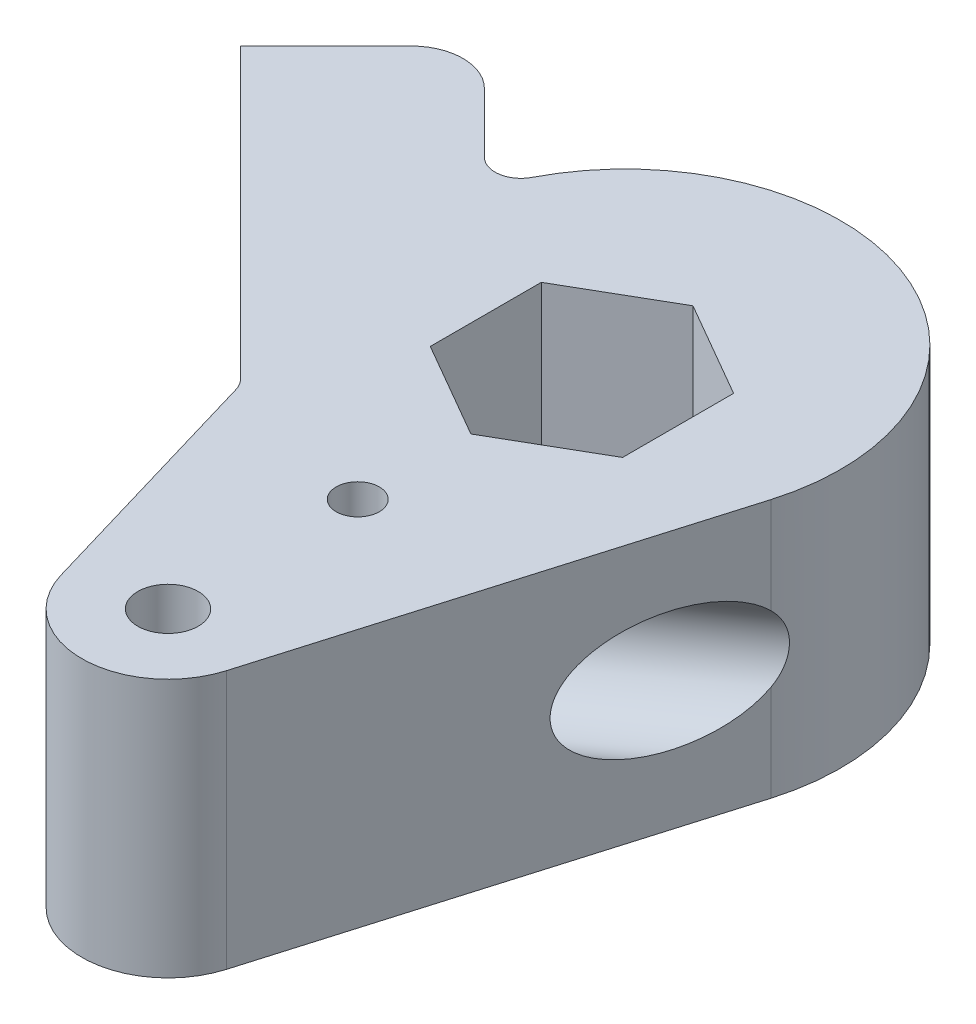
ISO-10303-21;
HEADER;
FILE_DESCRIPTION(('STEP AP214'),'2;1');
FILE_NAME('part.step','',(''),(''),'','','');
FILE_SCHEMA(('AUTOMOTIVE_DESIGN { 1 0 10303 214 1 1 1 1 }'));
ENDSEC;
DATA;
#1=APPLICATION_CONTEXT('core data for automotive mechanical design processes');
#2=APPLICATION_PROTOCOL_DEFINITION('international standard','automotive_design',2000,#1);
#3=PRODUCT_CONTEXT('',#1,'mechanical');
#4=PRODUCT('Part','Part','',(#3));
#5=PRODUCT_RELATED_PRODUCT_CATEGORY('part','',(#4));
#6=PRODUCT_DEFINITION_FORMATION('','',#4);
#7=PRODUCT_DEFINITION_CONTEXT('part definition',#1,'design');
#8=PRODUCT_DEFINITION('design','',#6,#7);
#9=PRODUCT_DEFINITION_SHAPE('','',#8);
#10=(LENGTH_UNIT() NAMED_UNIT(*) SI_UNIT(.MILLI.,.METRE.));
#11=(NAMED_UNIT(*) PLANE_ANGLE_UNIT() SI_UNIT($,.RADIAN.));
#12=(NAMED_UNIT(*) SI_UNIT($,.STERADIAN.) SOLID_ANGLE_UNIT());
#13=UNCERTAINTY_MEASURE_WITH_UNIT(LENGTH_MEASURE(1.E-05),#10,'distance_accuracy_value','');
#14=(GEOMETRIC_REPRESENTATION_CONTEXT(3) GLOBAL_UNCERTAINTY_ASSIGNED_CONTEXT((#13)) GLOBAL_UNIT_ASSIGNED_CONTEXT((#10,
#11,#12)) REPRESENTATION_CONTEXT('',''));
#15=CARTESIAN_POINT('',(0.,0.,0.));
#16=DIRECTION('',(0.,0.,1.));
#17=DIRECTION('',(1.,0.,0.));
#18=AXIS2_PLACEMENT_3D('',#15,#16,#17);
#19=CARTESIAN_POINT('',(21.5433225867882,7.5,-2.08479687335261));
#20=DIRECTION('',(-0.819152044288991,0.,0.573576436351047));
#21=DIRECTION('',(0.573576436351047,0.,0.819152044288991));
#22=AXIS2_PLACEMENT_3D('',#19,#20,#21);
#23=CYLINDRICAL_SURFACE('',#22,1.95);
#24=CARTESIAN_POINT('',(0.716970545438802,8.99666295470958,14.0239400553612));
#25=CARTESIAN_POINT('',(0.74244034188439,8.99665153578094,14.006111246936));
#26=CARTESIAN_POINT('',(0.767222036106041,8.99763278965821,13.9873367591717));
#27=CARTESIAN_POINT('',(0.815208565556345,9.00147451084377,13.9480994698423));
#28=CARTESIAN_POINT('',(0.83841523047688,9.00433275497132,13.9276386906281));
#29=CARTESIAN_POINT('',(0.905016488414462,9.01549340190903,13.8643856355436));
#30=CARTESIAN_POINT('',(0.945904236156547,9.02638600169875,13.81936136744));
#31=CARTESIAN_POINT('',(1.01990610183928,9.05334430395239,13.7251740505432));
#32=CARTESIAN_POINT('',(1.05305281266805,9.0693876158075,13.6760295836279));
#33=CARTESIAN_POINT('',(1.11177481728667,9.10478716029796,13.5743788922074));
#34=CARTESIAN_POINT('',(1.13732995953031,9.12415199888252,13.5218641624224));
#35=CARTESIAN_POINT('',(1.18382634382519,9.16726910150522,13.4067373087248));
#36=CARTESIAN_POINT('',(1.20360946888743,9.19125504598093,13.3437452964728));
#37=CARTESIAN_POINT('',(1.23307169573789,9.23901171240449,13.2153476321127));
#38=CARTESIAN_POINT('',(1.24274681928874,9.26278234596579,13.1499410401684));
#39=CARTESIAN_POINT('',(1.25220869513291,9.31108197191154,13.0090240557059));
#40=CARTESIAN_POINT('',(1.25055105281718,9.33530983671658,12.9333029874027));
#41=CARTESIAN_POINT('',(1.23317320275807,9.37828509148767,12.781892070439));
#42=CARTESIAN_POINT('',(1.21746657045799,9.39703774891171,12.7062022621936));
#43=CARTESIAN_POINT('',(1.17411124991937,9.42515870825533,12.5654961550458));
#44=CARTESIAN_POINT('',(1.14790061168448,9.43530952653827,12.5001974119533));
#45=CARTESIAN_POINT('',(1.08447316569616,9.44817187102651,12.374410500201));
#46=CARTESIAN_POINT('',(1.04726882690009,9.45089178967662,12.3139169795969));
#47=CARTESIAN_POINT('',(0.969196678887126,9.44874693885896,12.2082593735044));
#48=CARTESIAN_POINT('',(0.929584436397717,9.44489722642764,12.1621364310037));
#49=CARTESIAN_POINT('',(0.84454965403594,9.43185091254498,12.0764867696995));
#50=CARTESIAN_POINT('',(0.799126643126686,9.42265387741045,12.0369605862469));
#51=CARTESIAN_POINT('',(0.70385939308494,9.39969110247294,11.9652824271803));
#52=CARTESIAN_POINT('',(0.654013987931288,9.38592415511509,11.9331324044466));
#53=CARTESIAN_POINT('',(0.551178744777926,9.354868658165,11.8765455922883));
#54=CARTESIAN_POINT('',(0.498188476733835,9.3375796261552,11.8521098606552));
#55=CARTESIAN_POINT('',(0.383196039082617,9.29828679872873,11.8083996610312));
#56=CARTESIAN_POINT('',(0.320904653355299,9.2759630388235,11.7901763681155));
#57=CARTESIAN_POINT('',(0.194607551586207,9.2300475693117,11.7635515298522));
#58=CARTESIAN_POINT('',(0.130598754421194,9.20645349211165,11.7551690385292));
#59=CARTESIAN_POINT('',(-0.00733161160222996,9.15667029506228,11.7478550930901));
#60=CARTESIAN_POINT('',(-0.0813772889574155,9.13058486330539,11.7504243865547));
#61=CARTESIAN_POINT('',(-0.228987202426297,9.08277083102809,11.7689156156727));
#62=CARTESIAN_POINT('',(-0.302552178131016,9.06102516704794,11.7847839271504));
#63=CARTESIAN_POINT('',(-0.434538738181924,9.02883732389422,11.8263068735044));
#64=CARTESIAN_POINT('',(-0.493322279856361,9.01707123527352,11.8497129565178));
#65=CARTESIAN_POINT('',(-0.579171075303788,9.0049891501035,11.8918056696129));
#66=CARTESIAN_POINT('',(-0.607543002747302,9.00188827372152,11.907100017152));
#67=CARTESIAN_POINT('',(-0.663171634436151,8.99771672338337,11.9399289377363));
#68=CARTESIAN_POINT('',(-0.690426603656105,8.99664909891057,11.9574668336978));
#69=CARTESIAN_POINT('',(-0.716970545438816,8.99666295470958,11.9760599446388));
#70=B_SPLINE_CURVE_WITH_KNOTS('',3,(#24,#25,#26,#27,#28,#29,#30,#31,#32,#33,#34,#35,#36,#37,#38,
#39,#40,#41,#42,#43,#44,#45,#46,#47,#48,#49,#50,#51,#52,#53,#54,#55,#56,#57,#58,#59,#60,#61,#62,
#63,#64,#65,#66,#67,#68,#69),.UNSPECIFIED.,.F.,.F.,(4,2,2,2,2,2,2,2,2,2,2,2,2,2,2,2,2,2,2,2,2,2,
4),(0.,0.0931931628247664,0.186276142625983,0.370592708225991,0.554118642209381,
0.738127473230242,0.948073691711505,1.15810250828169,1.39535710413075,1.63238268985327,
1.84435012875189,2.05607807284427,2.23796198174081,2.41986064400171,2.60180740952768,
2.78377911295526,2.98888635778984,3.19439008520416,3.42889590928542,3.66246068523198,
3.85439322248913,3.95138849787021,4.04852913313194),.UNSPECIFIED.);
#71=CARTESIAN_POINT('',(0.716970545438809,8.99666295470958,14.0239400553612));
#72=VERTEX_POINT('',#71);
#73=CARTESIAN_POINT('',(-0.71697054543881,8.99666295470958,11.9760599446388));
#74=VERTEX_POINT('',#73);
#75=EDGE_CURVE('E207',#72,#74,#70,.T.);
#76=ORIENTED_EDGE('',*,*,#75,.T.);
#77=CARTESIAN_POINT('',(0.,7.5,13.));
#78=DIRECTION('',(-0.819152044288991,0.,0.573576436351047));
#79=DIRECTION('',(0.573576436351047,0.,0.819152044288991));
#80=AXIS2_PLACEMENT_3D('',#77,#78,#79);
#81=CIRCLE('',#80,1.95);
#82=CARTESIAN_POINT('',(-0.71697054543881,6.00333704529042,11.9760599446388));
#83=VERTEX_POINT('',#82);
#84=EDGE_CURVE('E468',#74,#83,#81,.T.);
#85=ORIENTED_EDGE('',*,*,#84,.T.);
#86=CARTESIAN_POINT('',(-0.716970545438816,6.00333704529042,11.9760599446388));
#87=CARTESIAN_POINT('',(-0.691505762293426,6.00334846421906,11.9582239764789));
#88=CARTESIAN_POINT('',(-0.66538767607272,6.00236721034179,11.9413580542842));
#89=CARTESIAN_POINT('',(-0.612104325149941,5.99852548915622,11.9096854099828));
#90=CARTESIAN_POINT('',(-0.584940335044608,5.99566724502868,11.8948762768433));
#91=CARTESIAN_POINT('',(-0.502722934154049,5.98450659809097,11.8539253851901));
#92=CARTESIAN_POINT('',(-0.446429528317821,5.97361399830125,11.8309026769862));
#93=CARTESIAN_POINT('',(-0.332612272951119,5.94665569604761,11.7935776295043));
#94=CARTESIAN_POINT('',(-0.275094737249922,5.93061238419249,11.7792383075532));
#95=CARTESIAN_POINT('',(-0.159490224188266,5.89521283970203,11.7588242571841));
#96=CARTESIAN_POINT('',(-0.101402146713858,5.87584800111748,11.7527713740024));
#97=CARTESIAN_POINT('',(0.0226844081808215,5.83273089849478,11.7484547677896));
#98=CARTESIAN_POINT('',(0.0886437645316572,5.80874495401907,11.7514092482113));
#99=CARTESIAN_POINT('',(0.219374777307086,5.76098828759551,11.7676383986151));
#100=CARTESIAN_POINT('',(0.284145956251446,5.7372176540342,11.7809171283604));
#101=CARTESIAN_POINT('',(0.41980075882661,5.68891802808846,11.8202223206737));
#102=CARTESIAN_POINT('',(0.490388340886741,5.66469016328342,11.8476781255596));
#103=CARTESIAN_POINT('',(0.626724487496084,5.62171490851233,11.9157935465462));
#104=CARTESIAN_POINT('',(0.6924776571425,5.60296225108828,11.9564403920804));
#105=CARTESIAN_POINT('',(0.809869754784223,5.57484129174466,12.0453053897958));
#106=CARTESIAN_POINT('',(0.862265935569119,5.56469047346172,12.0922688186027));
#107=CARTESIAN_POINT('',(0.958773504166474,5.55182812897349,12.1948927791393));
#108=CARTESIAN_POINT('',(1.00289418579616,5.54910821032338,12.2505434243544));
#109=CARTESIAN_POINT('',(1.0754776113181,5.55125306114104,12.3600442753103));
#110=CARTESIAN_POINT('',(1.10527081518127,5.55510277357236,12.4130425826751));
#111=CARTESIAN_POINT('',(1.15667156143053,5.56814908745502,12.5222430496057));
#112=CARTESIAN_POINT('',(1.17827843964736,5.57734612258955,12.5784454687006));
#113=CARTESIAN_POINT('',(1.2130505582802,5.60030889752706,12.6924827748046));
#114=CARTESIAN_POINT('',(1.22621356478641,5.61407584488491,12.7503180895909));
#115=CARTESIAN_POINT('',(1.24421605000313,5.645131341835,12.8663054383436));
#116=CARTESIAN_POINT('',(1.24905438763093,5.6624203738448,12.9244575146335));
#117=CARTESIAN_POINT('',(1.25079880966386,5.70171320127127,13.0474648284807));
#118=CARTESIAN_POINT('',(1.24661819486872,5.7240369611765,13.1122323172421));
#119=CARTESIAN_POINT('',(1.22844120606573,5.7699524306883,13.2400190028));
#120=CARTESIAN_POINT('',(1.2144258733252,5.79354650788835,13.303034578045));
#121=CARTESIAN_POINT('',(1.17412377032693,5.84332970493772,13.4351482418469));
#122=CARTESIAN_POINT('',(1.14638431103591,5.86941513669461,13.5038496683397));
#123=CARTESIAN_POINT('',(1.07852267572352,5.91722916897192,13.636233241948));
#124=CARTESIAN_POINT('',(1.03845063698937,5.93897483295206,13.6999344246001));
#125=CARTESIAN_POINT('',(0.954289768521492,5.97116267610578,13.8097595370595));
#126=CARTESIAN_POINT('',(0.912190089683654,5.98292876472648,13.8569926455277));
#127=CARTESIAN_POINT('',(0.843273860476016,5.99501084989651,13.9232675693473));
#128=CARTESIAN_POINT('',(0.81919810426314,5.99811172627848,13.944697485266));
#129=CARTESIAN_POINT('',(0.769322897258523,6.00228327661663,13.985743147845));
#130=CARTESIAN_POINT('',(0.743520917360457,6.00335090108943,14.0053561276104));
#131=CARTESIAN_POINT('',(0.716970545438803,6.00333704529042,14.0239400553612));
#132=B_SPLINE_CURVE_WITH_KNOTS('',3,(#86,#87,#88,#89,#90,#91,#92,#93,#94,#95,#96,#97,#98,#99,
#100,#101,#102,#103,#104,#105,#106,#107,#108,#109,#110,#111,#112,#113,#114,#115,#116,#117,#118,
#119,#120,#121,#122,#123,#124,#125,#126,#127,#128,#129,#130,#131),.UNSPECIFIED.,.F.,.F.,(4,2,2,
2,2,2,2,2,2,2,2,2,2,2,2,2,2,2,2,2,2,2,4),(0.,0.093193162824766,0.186276142625983,
0.370592708225991,0.554118642209382,0.738127473230242,0.948073691711505,1.15810250828169,
1.39535710413076,1.63238268985327,1.84435012875189,2.05607807284427,2.23796198174081,
2.41986064400171,2.60180740952768,2.78377911295526,2.98888635778984,3.19439008520417,
3.42889590928542,3.66246068523198,3.85439322248913,3.95138849787022,4.04852913313194),.UNSPECIFIED.);
#133=CARTESIAN_POINT('',(0.716970545438809,6.00333704529042,14.0239400553612));
#134=VERTEX_POINT('',#133);
#135=EDGE_CURVE('E198',#83,#134,#132,.T.);
#136=ORIENTED_EDGE('',*,*,#135,.T.);
#137=EDGE_CURVE('E466',#134,#72,#81,.T.);
#138=ORIENTED_EDGE('',*,*,#137,.T.);
#139=EDGE_LOOP('',(#76,#85,#136,#138));
#140=FACE_BOUND('',#139,.T.);
#141=CARTESIAN_POINT('',(5.73406431002294,7.5,8.98496494554267));
#142=DIRECTION('',(0.819152044288991,0.,-0.573576436351047));
#143=DIRECTION('',(-0.573576436351047,0.,-0.819152044288991));
#144=AXIS2_PLACEMENT_3D('',#141,#142,#143);
#145=CIRCLE('',#144,1.95);
#146=CARTESIAN_POINT('',(4.6155902591384,7.5,7.38761845917913));
#147=VERTEX_POINT('',#146);
#148=EDGE_CURVE('E182',#147,#147,#145,.F.);
#149=ORIENTED_EDGE('',*,*,#148,.F.);
#150=EDGE_LOOP('',(#149));
#151=FACE_BOUND('',#150,.T.);
#152=ADVANCED_FACE('F36',(#140,#151),#23,.F.);
#153=CARTESIAN_POINT('',(0.,15.,-2.5));
#154=DIRECTION('',(0.,-1.,0.));
#155=DIRECTION('',(0.,0.,-1.));
#156=AXIS2_PLACEMENT_3D('',#153,#154,#155);
#157=CYLINDRICAL_SURFACE('',#156,12.5);
#158=DIRECTION('',(0.,-1.,0.));
#159=VECTOR('',#158,1.);
#160=CARTESIAN_POINT('',(11.9889292708857,15.,1.03773584905661));
#161=LINE('',#160,#159);
#162=CARTESIAN_POINT('',(11.9889292708857,15.,1.03773584905661));
#163=VERTEX_POINT('',#162);
#164=CARTESIAN_POINT('',(11.9889292708857,9.42610876795671,1.03773584905661));
#165=VERTEX_POINT('',#164);
#166=EDGE_CURVE('E180',#163,#165,#161,.T.);
#167=ORIENTED_EDGE('',*,*,#166,.T.);
#168=CARTESIAN_POINT('',(11.9889292708857,9.42610876795671,1.03773584905661));
#169=CARTESIAN_POINT('',(12.0047331476933,9.37330231806729,0.984185218039004));
#170=CARTESIAN_POINT('',(12.0196692676194,9.31862633595629,0.932239149187983));
#171=CARTESIAN_POINT('',(12.0478301443979,9.20549067272676,0.832039973463307));
#172=CARTESIAN_POINT('',(12.0610533696007,9.1470276744127,0.783790187297182));
#173=CARTESIAN_POINT('',(12.0982745098479,8.96543030851816,0.644987884657432));
#174=CARTESIAN_POINT('',(12.1196649814929,8.83661887281538,0.560932222336484));
#175=CARTESIAN_POINT('',(12.1556744261868,8.56528221874335,0.414676315717395));
#176=CARTESIAN_POINT('',(12.1702569249279,8.42268796297729,0.352594215901582));
#177=CARTESIAN_POINT('',(12.1926505572115,8.12841067974923,0.25532328943551));
#178=CARTESIAN_POINT('',(12.2004810310948,7.97675495106006,0.220057684758262));
#179=CARTESIAN_POINT('',(12.2091984018924,7.68246220607608,0.180641747240069));
#180=CARTESIAN_POINT('',(12.2106208984856,7.54016021976855,0.174092589306254));
#181=CARTESIAN_POINT('',(12.2080128923116,7.25664262891204,0.185974928085635));
#182=CARTESIAN_POINT('',(12.2039823323694,7.11542703576947,0.204406686722752));
#183=CARTESIAN_POINT('',(12.1907846494979,6.84647476570445,0.263257461652661));
#184=CARTESIAN_POINT('',(12.1819247797935,6.71842925154846,0.302357405620548));
#185=CARTESIAN_POINT('',(12.1591682383308,6.47008423390452,0.399501120331491));
#186=CARTESIAN_POINT('',(12.1452643285045,6.34979615576545,0.457572102052418));
#187=CARTESIAN_POINT('',(12.1112720025954,6.11208514399124,0.593911911947338));
#188=CARTESIAN_POINT('',(12.0908540885583,5.99530026637814,0.673208339741153));
#189=CARTESIAN_POINT('',(12.0558670754762,5.82987828981024,0.802736397052253));
#190=CARTESIAN_POINT('',(12.0434996289924,5.77643567445633,0.847601890022232));
#191=CARTESIAN_POINT('',(12.0173091633876,5.67276555910011,0.940437610007517));
#192=CARTESIAN_POINT('',(12.0034872226069,5.62253572100025,0.988405526904892));
#193=CARTESIAN_POINT('',(11.9889292708857,5.57389123204329,1.03773584905661));
#194=B_SPLINE_CURVE_WITH_KNOTS('',3,(#168,#169,#170,#171,#172,#173,#174,#175,#176,#177,#178,
#179,#180,#181,#182,#183,#184,#185,#186,#187,#188,#189,#190,#191,#192,#193),.UNSPECIFIED.,.F.,
.F.,(4,2,2,2,2,2,2,2,2,2,2,2,4),(0.,0.230468757514471,0.461142195368183,0.924808370598939,
1.39093095007059,1.855713901147,2.28082701137157,2.70594457892474,3.10672609601005,
3.50808501398563,3.9342836766376,4.14675297514224,4.35906584731251),.UNSPECIFIED.);
#195=CARTESIAN_POINT('',(11.9889292708857,5.57389123204329,1.03773584905661));
#196=VERTEX_POINT('',#195);
#197=EDGE_CURVE('E50',#165,#196,#194,.T.);
#198=ORIENTED_EDGE('',*,*,#197,.T.);
#199=CARTESIAN_POINT('',(11.9889292708857,0.,1.03773584905661));
#200=VERTEX_POINT('',#199);
#201=EDGE_CURVE('E177',#196,#200,#161,.T.);
#202=ORIENTED_EDGE('',*,*,#201,.T.);
#203=CARTESIAN_POINT('',(0.,0.,-2.5));
#204=DIRECTION('',(0.,1.,0.));
#205=DIRECTION('',(0.,0.,-1.));
#206=AXIS2_PLACEMENT_3D('',#203,#204,#205);
#207=CIRCLE('',#206,12.5);
#208=CARTESIAN_POINT('',(-11.1125712251908,0.,-8.22370166632228));
#209=VERTEX_POINT('',#208);
#210=EDGE_CURVE('E340',#200,#209,#207,.T.);
#211=ORIENTED_EDGE('',*,*,#210,.T.);
#212=DIRECTION('',(0.,-1.,0.));
#213=VECTOR('',#212,1.);
#214=CARTESIAN_POINT('',(-11.1125712251908,15.,-8.22370166632228));
#215=LINE('',#214,#213);
#216=CARTESIAN_POINT('',(-11.1125712251908,15.,-8.22370166632228));
#217=VERTEX_POINT('',#216);
#218=EDGE_CURVE('E293',#209,#217,#215,.F.);
#219=ORIENTED_EDGE('',*,*,#218,.T.);
#220=CARTESIAN_POINT('',(0.,15.,-2.5));
#221=DIRECTION('',(0.,1.,0.));
#222=DIRECTION('',(0.,0.,-1.));
#223=AXIS2_PLACEMENT_3D('',#220,#221,#222);
#224=CIRCLE('',#223,12.5);
#225=EDGE_CURVE('E355',#163,#217,#224,.T.);
#226=ORIENTED_EDGE('',*,*,#225,.F.);
#227=EDGE_LOOP('',(#167,#198,#202,#211,#219,#226));
#228=FACE_BOUND('',#227,.T.);
#229=ADVANCED_FACE('F176',(#228),#157,.T.);
#230=CARTESIAN_POINT('',(-4.79557170835427,15.,25.4150943396226));
#231=DIRECTION('',(0.959114341670855,0.,-0.283018867924529));
#232=DIRECTION('',(-0.283018867924529,0.,-0.959114341670855));
#233=AXIS2_PLACEMENT_3D('',#230,#231,#232);
#234=PLANE('',#233);
#235=DIRECTION('',(0.283018867924529,0.,0.959114341670855));
#236=VECTOR('',#235,1.);
#237=CARTESIAN_POINT('',(-4.79557170835427,15.,25.4150943396226));
#238=LINE('',#237,#236);
#239=CARTESIAN_POINT('',(-9.04592973589662,15.,11.0111806664933));
#240=VERTEX_POINT('',#239);
#241=CARTESIAN_POINT('',(-4.79557170835427,15.,25.4150943396226));
#242=VERTEX_POINT('',#241);
#243=EDGE_CURVE('E191',#240,#242,#238,.T.);
#244=ORIENTED_EDGE('',*,*,#243,.F.);
#245=DIRECTION('',(0.,1.,0.));
#246=VECTOR('',#245,1.);
#247=CARTESIAN_POINT('',(-9.04592973589662,0.,11.0111806664933));
#248=LINE('',#247,#246);
#249=CARTESIAN_POINT('',(-9.04592973589662,0.,11.0111806664933));
#250=VERTEX_POINT('',#249);
#251=EDGE_CURVE('E284',#240,#250,#248,.F.);
#252=ORIENTED_EDGE('',*,*,#251,.T.);
#253=DIRECTION('',(0.283018867924529,0.,0.959114341670855));
#254=VECTOR('',#253,1.);
#255=CARTESIAN_POINT('',(-4.79557170835427,0.,25.4150943396226));
#256=LINE('',#255,#254);
#257=CARTESIAN_POINT('',(-4.79557170835427,0.,25.4150943396226));
#258=VERTEX_POINT('',#257);
#259=EDGE_CURVE('E348',#250,#258,#256,.T.);
#260=ORIENTED_EDGE('',*,*,#259,.T.);
#261=DIRECTION('',(0.,-1.,0.));
#262=VECTOR('',#261,1.);
#263=CARTESIAN_POINT('',(-4.79557170835427,15.,25.4150943396226));
#264=LINE('',#263,#262);
#265=EDGE_CURVE('E187',#242,#258,#264,.T.);
#266=ORIENTED_EDGE('',*,*,#265,.F.);
#267=EDGE_LOOP('',(#244,#252,#260,#266));
#268=FACE_BOUND('',#267,.T.);
#269=ADVANCED_FACE('F315',(#268),#234,.F.);
#270=CARTESIAN_POINT('',(0.,15.,24.));
#271=DIRECTION('',(0.,1.,0.));
#272=DIRECTION('',(0.,0.,1.));
#273=AXIS2_PLACEMENT_3D('',#270,#271,#272);
#274=PLANE('',#273);
#275=ORIENTED_EDGE('',*,*,#225,.T.);
#276=CARTESIAN_POINT('',(-12.4460797722137,15.,-8.91054586628096));
#277=DIRECTION('',(0.,1.,0.));
#278=DIRECTION('',(0.,0.,1.));
#279=AXIS2_PLACEMENT_3D('',#276,#277,#278);
#280=CIRCLE('',#279,1.5);
#281=CARTESIAN_POINT('',(-13.5067399439936,15.,-7.84988569450113));
#282=VERTEX_POINT('',#281);
#283=EDGE_CURVE('E44',#217,#282,#280,.F.);
#284=ORIENTED_EDGE('',*,*,#283,.T.);
#285=DIRECTION('',(-0.707106781186549,0.,-0.707106781186546));
#286=VECTOR('',#285,1.);
#287=CARTESIAN_POINT('',(-19.0918830920368,15.,-13.4350288425444));
#288=LINE('',#287,#286);
#289=CARTESIAN_POINT('',(-16.9705627484772,15.,-11.3137084989847));
#290=VERTEX_POINT('',#289);
#291=EDGE_CURVE('E510',#282,#290,#288,.T.);
#292=ORIENTED_EDGE('',*,*,#291,.T.);
#293=CARTESIAN_POINT('',(-19.0918830920368,15.,-9.19238815542507));
#294=DIRECTION('',(0.,1.,0.));
#295=DIRECTION('',(0.,0.,1.));
#296=AXIS2_PLACEMENT_3D('',#293,#294,#295);
#297=CIRCLE('',#296,3.);
#298=CARTESIAN_POINT('',(-21.2132034355964,15.,-11.3137084989847));
#299=VERTEX_POINT('',#298);
#300=EDGE_CURVE('E263',#290,#299,#297,.T.);
#301=ORIENTED_EDGE('',*,*,#300,.T.);
#302=DIRECTION('',(-0.707106781186546,0.,0.707106781186549));
#303=VECTOR('',#302,1.);
#304=CARTESIAN_POINT('',(-19.0918830920368,15.,-13.4350288425444));
#305=LINE('',#304,#303);
#306=CARTESIAN_POINT('',(-26.1629509039023,15.,-6.36396103067887));
#307=VERTEX_POINT('',#306);
#308=EDGE_CURVE('E511',#299,#307,#305,.T.);
#309=ORIENTED_EDGE('',*,*,#308,.T.);
#310=DIRECTION('',(0.707106781186549,0.,0.707106781186546));
#311=VECTOR('',#310,1.);
#312=CARTESIAN_POINT('',(-26.1629509039023,15.,-6.36396103067887));
#313=LINE('',#312,#311);
#314=CARTESIAN_POINT('',(-9.42394107662308,15.,10.3750487966002));
#315=VERTEX_POINT('',#314);
#316=EDGE_CURVE('E512',#307,#315,#313,.T.);
#317=ORIENTED_EDGE('',*,*,#316,.T.);
#318=CARTESIAN_POINT('',(-10.4846012484029,15.,11.4357089683801));
#319=DIRECTION('',(0.,1.,0.));
#320=DIRECTION('',(0.,0.,1.));
#321=AXIS2_PLACEMENT_3D('',#318,#319,#320);
#322=CIRCLE('',#321,1.5);
#323=EDGE_CURVE('E290',#315,#240,#322,.F.);
#324=ORIENTED_EDGE('',*,*,#323,.T.);
#325=ORIENTED_EDGE('',*,*,#243,.T.);
#326=CARTESIAN_POINT('',(0.,15.,24.));
#327=DIRECTION('',(0.,1.,0.));
#328=DIRECTION('',(0.,0.,1.));
#329=AXIS2_PLACEMENT_3D('',#326,#327,#328);
#330=CIRCLE('',#329,5.);
#331=CARTESIAN_POINT('',(4.79557170835428,15.,25.4150943396226));
#332=VERTEX_POINT('',#331);
#333=EDGE_CURVE('E349',#242,#332,#330,.T.);
#334=ORIENTED_EDGE('',*,*,#333,.T.);
#335=DIRECTION('',(0.283018867924528,0.,-0.959114341670855));
#336=VECTOR('',#335,1.);
#337=CARTESIAN_POINT('',(11.9889292708857,15.,1.03773584905661));
#338=LINE('',#337,#336);
#339=EDGE_CURVE('E352',#332,#163,#338,.T.);
#340=ORIENTED_EDGE('',*,*,#339,.T.);
#341=EDGE_LOOP('',(#275,#284,#292,#301,#309,#317,#324,#325,#334,#340));
#342=FACE_BOUND('',#341,.T.);
#343=CARTESIAN_POINT('',(0.,15.,13.));
#344=DIRECTION('',(0.,1.,0.));
#345=DIRECTION('',(0.,0.,1.));
#346=AXIS2_PLACEMENT_3D('',#343,#344,#345);
#347=CIRCLE('',#346,1.25);
#348=CARTESIAN_POINT('',(0.,15.,14.25));
#349=VERTEX_POINT('',#348);
#350=EDGE_CURVE('E404',#349,#349,#347,.T.);
#351=ORIENTED_EDGE('',*,*,#350,.F.);
#352=EDGE_LOOP('',(#351));
#353=FACE_BOUND('',#352,.T.);
#354=DIRECTION('',(0.866025403784439,0.,-0.5));
#355=VECTOR('',#354,1.);
#356=CARTESIAN_POINT('',(0.,15.,6.43745550146433));
#357=LINE('',#356,#355);
#358=CARTESIAN_POINT('',(0.,15.,6.43745550146433));
#359=VERTEX_POINT('',#358);
#360=CARTESIAN_POINT('',(5.575,15.,3.21872775073217));
#361=VERTEX_POINT('',#360);
#362=EDGE_CURVE('E414',#359,#361,#357,.T.);
#363=ORIENTED_EDGE('',*,*,#362,.F.);
#364=DIRECTION('',(0.866025403784438,0.,0.5));
#365=VECTOR('',#364,1.);
#366=CARTESIAN_POINT('',(-5.575,15.,3.21872775073216));
#367=LINE('',#366,#365);
#368=CARTESIAN_POINT('',(-5.575,15.,3.21872775073216));
#369=VERTEX_POINT('',#368);
#370=EDGE_CURVE('E406',#369,#359,#367,.T.);
#371=ORIENTED_EDGE('',*,*,#370,.F.);
#372=DIRECTION('',(0.,0.,1.));
#373=VECTOR('',#372,1.);
#374=CARTESIAN_POINT('',(-5.575,15.,-3.21872775073217));
#375=LINE('',#374,#373);
#376=CARTESIAN_POINT('',(-5.575,15.,-3.21872775073217));
#377=VERTEX_POINT('',#376);
#378=EDGE_CURVE('E423',#377,#369,#375,.T.);
#379=ORIENTED_EDGE('',*,*,#378,.F.);
#380=DIRECTION('',(-0.866025403784439,0.,0.5));
#381=VECTOR('',#380,1.);
#382=CARTESIAN_POINT('',(0.,15.,-6.43745550146433));
#383=LINE('',#382,#381);
#384=CARTESIAN_POINT('',(0.,15.,-6.43745550146433));
#385=VERTEX_POINT('',#384);
#386=EDGE_CURVE('E420',#385,#377,#383,.T.);
#387=ORIENTED_EDGE('',*,*,#386,.F.);
#388=DIRECTION('',(-0.866025403784439,0.,-0.5));
#389=VECTOR('',#388,1.);
#390=CARTESIAN_POINT('',(5.575,15.,-3.21872775073216));
#391=LINE('',#390,#389);
#392=CARTESIAN_POINT('',(5.575,15.,-3.21872775073216));
#393=VERTEX_POINT('',#392);
#394=EDGE_CURVE('E418',#393,#385,#391,.T.);
#395=ORIENTED_EDGE('',*,*,#394,.F.);
#396=DIRECTION('',(0.,0.,-1.));
#397=VECTOR('',#396,1.);
#398=CARTESIAN_POINT('',(5.575,15.,3.21872775073217));
#399=LINE('',#398,#397);
#400=EDGE_CURVE('E416',#361,#393,#399,.T.);
#401=ORIENTED_EDGE('',*,*,#400,.F.);
#402=EDGE_LOOP('',(#363,#371,#379,#387,#395,#401));
#403=FACE_BOUND('',#402,.T.);
#404=CARTESIAN_POINT('',(0.,15.,24.));
#405=DIRECTION('',(0.,1.,0.));
#406=DIRECTION('',(0.,0.,1.));
#407=AXIS2_PLACEMENT_3D('',#404,#405,#406);
#408=CIRCLE('',#407,1.75);
#409=CARTESIAN_POINT('',(0.,15.,25.75));
#410=VERTEX_POINT('',#409);
#411=EDGE_CURVE('E399',#410,#410,#408,.T.);
#412=ORIENTED_EDGE('',*,*,#411,.F.);
#413=EDGE_LOOP('',(#412));
#414=FACE_BOUND('',#413,.T.);
#415=ADVANCED_FACE('F331',(#342,#353,#403,#414),#274,.T.);
#416=CARTESIAN_POINT('',(0.,0.,24.));
#417=DIRECTION('',(0.,1.,0.));
#418=DIRECTION('',(0.,0.,1.));
#419=AXIS2_PLACEMENT_3D('',#416,#417,#418);
#420=PLANE('',#419);
#421=DIRECTION('',(-0.707106781186546,0.,0.707106781186549));
#422=VECTOR('',#421,1.);
#423=CARTESIAN_POINT('',(-19.0918830920368,0.,-13.4350288425444));
#424=LINE('',#423,#422);
#425=CARTESIAN_POINT('',(-21.2132034355964,0.,-11.3137084989847));
#426=VERTEX_POINT('',#425);
#427=CARTESIAN_POINT('',(-26.1629509039023,0.,-6.36396103067887));
#428=VERTEX_POINT('',#427);
#429=EDGE_CURVE('E521',#426,#428,#424,.T.);
#430=ORIENTED_EDGE('',*,*,#429,.F.);
#431=CARTESIAN_POINT('',(-19.0918830920368,0.,-9.19238815542507));
#432=DIRECTION('',(0.,1.,0.));
#433=DIRECTION('',(0.,0.,1.));
#434=AXIS2_PLACEMENT_3D('',#431,#432,#433);
#435=CIRCLE('',#434,3.);
#436=CARTESIAN_POINT('',(-16.9705627484772,0.,-11.3137084989847));
#437=VERTEX_POINT('',#436);
#438=EDGE_CURVE('E484',#426,#437,#435,.F.);
#439=ORIENTED_EDGE('',*,*,#438,.T.);
#440=DIRECTION('',(-0.707106781186549,0.,-0.707106781186546));
#441=VECTOR('',#440,1.);
#442=CARTESIAN_POINT('',(-19.0918830920368,0.,-13.4350288425444));
#443=LINE('',#442,#441);
#444=CARTESIAN_POINT('',(-13.5067399439936,0.,-7.84988569450113));
#445=VERTEX_POINT('',#444);
#446=EDGE_CURVE('E498',#445,#437,#443,.T.);
#447=ORIENTED_EDGE('',*,*,#446,.F.);
#448=CARTESIAN_POINT('',(-12.4460797722137,0.,-8.91054586628096));
#449=DIRECTION('',(0.,1.,0.));
#450=DIRECTION('',(0.,0.,1.));
#451=AXIS2_PLACEMENT_3D('',#448,#449,#450);
#452=CIRCLE('',#451,1.5);
#453=EDGE_CURVE('E57',#445,#209,#452,.T.);
#454=ORIENTED_EDGE('',*,*,#453,.T.);
#455=ORIENTED_EDGE('',*,*,#210,.F.);
#456=DIRECTION('',(0.283018867924528,0.,-0.959114341670855));
#457=VECTOR('',#456,1.);
#458=CARTESIAN_POINT('',(11.9889292708857,0.,1.03773584905661));
#459=LINE('',#458,#457);
#460=CARTESIAN_POINT('',(4.79557170835428,0.,25.4150943396226));
#461=VERTEX_POINT('',#460);
#462=EDGE_CURVE('E186',#461,#200,#459,.T.);
#463=ORIENTED_EDGE('',*,*,#462,.F.);
#464=CARTESIAN_POINT('',(0.,0.,24.));
#465=DIRECTION('',(0.,1.,0.));
#466=DIRECTION('',(0.,0.,1.));
#467=AXIS2_PLACEMENT_3D('',#464,#465,#466);
#468=CIRCLE('',#467,5.);
#469=EDGE_CURVE('E335',#258,#461,#468,.T.);
#470=ORIENTED_EDGE('',*,*,#469,.F.);
#471=ORIENTED_EDGE('',*,*,#259,.F.);
#472=CARTESIAN_POINT('',(-10.4846012484029,0.,11.4357089683801));
#473=DIRECTION('',(0.,1.,0.));
#474=DIRECTION('',(0.,0.,1.));
#475=AXIS2_PLACEMENT_3D('',#472,#473,#474);
#476=CIRCLE('',#475,1.5);
#477=CARTESIAN_POINT('',(-9.42394107662308,0.,10.3750487966002));
#478=VERTEX_POINT('',#477);
#479=EDGE_CURVE('E283',#250,#478,#476,.T.);
#480=ORIENTED_EDGE('',*,*,#479,.T.);
#481=DIRECTION('',(0.707106781186549,0.,0.707106781186546));
#482=VECTOR('',#481,1.);
#483=CARTESIAN_POINT('',(-26.1629509039023,0.,-6.36396103067887));
#484=LINE('',#483,#482);
#485=EDGE_CURVE('E515',#428,#478,#484,.T.);
#486=ORIENTED_EDGE('',*,*,#485,.F.);
#487=EDGE_LOOP('',(#430,#439,#447,#454,#455,#463,#470,#471,#480,#486));
#488=FACE_BOUND('',#487,.T.);
#489=CARTESIAN_POINT('',(0.,0.,0.));
#490=DIRECTION('',(0.,1.,0.));
#491=DIRECTION('',(0.,0.,1.));
#492=AXIS2_PLACEMENT_3D('',#489,#490,#491);
#493=CIRCLE('',#492,3.5);
#494=CARTESIAN_POINT('',(0.,0.,3.5));
#495=VERTEX_POINT('',#494);
#496=EDGE_CURVE('E455',#495,#495,#493,.T.);
#497=ORIENTED_EDGE('',*,*,#496,.T.);
#498=EDGE_LOOP('',(#497));
#499=FACE_BOUND('',#498,.T.);
#500=CARTESIAN_POINT('',(0.,0.,24.));
#501=DIRECTION('',(0.,1.,0.));
#502=DIRECTION('',(0.,0.,1.));
#503=AXIS2_PLACEMENT_3D('',#500,#501,#502);
#504=CIRCLE('',#503,1.75);
#505=CARTESIAN_POINT('',(0.,0.,25.75));
#506=VERTEX_POINT('',#505);
#507=EDGE_CURVE('E402',#506,#506,#504,.T.);
#508=ORIENTED_EDGE('',*,*,#507,.T.);
#509=EDGE_LOOP('',(#508));
#510=FACE_BOUND('',#509,.T.);
#511=CARTESIAN_POINT('',(0.,0.,13.));
#512=DIRECTION('',(0.,1.,0.));
#513=DIRECTION('',(0.,0.,1.));
#514=AXIS2_PLACEMENT_3D('',#511,#512,#513);
#515=CIRCLE('',#514,1.25);
#516=CARTESIAN_POINT('',(0.,0.,14.25));
#517=VERTEX_POINT('',#516);
#518=EDGE_CURVE('E409',#517,#517,#515,.T.);
#519=ORIENTED_EDGE('',*,*,#518,.T.);
#520=EDGE_LOOP('',(#519));
#521=FACE_BOUND('',#520,.T.);
#522=ADVANCED_FACE('F326',(#488,#499,#510,#521),#420,.F.);
#523=CARTESIAN_POINT('',(0.,15.,24.));
#524=DIRECTION('',(0.,-1.,0.));
#525=DIRECTION('',(0.,0.,-1.));
#526=AXIS2_PLACEMENT_3D('',#523,#524,#525);
#527=CYLINDRICAL_SURFACE('',#526,5.);
#528=ORIENTED_EDGE('',*,*,#469,.T.);
#529=DIRECTION('',(0.,-1.,0.));
#530=VECTOR('',#529,1.);
#531=CARTESIAN_POINT('',(4.79557170835428,15.,25.4150943396226));
#532=LINE('',#531,#530);
#533=EDGE_CURVE('E189',#332,#461,#532,.T.);
#534=ORIENTED_EDGE('',*,*,#533,.F.);
#535=ORIENTED_EDGE('',*,*,#333,.F.);
#536=ORIENTED_EDGE('',*,*,#265,.T.);
#537=EDGE_LOOP('',(#528,#534,#535,#536));
#538=FACE_BOUND('',#537,.T.);
#539=ADVANCED_FACE('F272',(#538),#527,.T.);
#540=CARTESIAN_POINT('',(11.9889292708857,15.,1.03773584905661));
#541=DIRECTION('',(-0.959114341670856,0.,-0.283018867924528));
#542=DIRECTION('',(-0.283018867924528,0.,0.959114341670856));
#543=AXIS2_PLACEMENT_3D('',#540,#541,#542);
#544=PLANE('',#543);
#545=ORIENTED_EDGE('',*,*,#201,.F.);
#546=CARTESIAN_POINT('',(10.662052187236,7.5,5.53435068571203));
#547=DIRECTION('',(-0.959114341670856,0.,-0.283018867924528));
#548=DIRECTION('',(0.283018867924528,0.,-0.959114341670855));
#549=AXIS2_PLACEMENT_3D('',#546,#547,#548);
#550=ELLIPSE('',#549,5.61502562888129,3.5);
#551=EDGE_CURVE('E12',#196,#165,#550,.T.);
#552=ORIENTED_EDGE('',*,*,#551,.T.);
#553=ORIENTED_EDGE('',*,*,#166,.F.);
#554=ORIENTED_EDGE('',*,*,#339,.F.);
#555=ORIENTED_EDGE('',*,*,#533,.T.);
#556=ORIENTED_EDGE('',*,*,#462,.T.);
#557=EDGE_LOOP('',(#545,#552,#553,#554,#555,#556));
#558=FACE_BOUND('',#557,.T.);
#559=ADVANCED_FACE('F184',(#558),#544,.F.);
#560=CARTESIAN_POINT('',(-5.575,15.,3.21872775073216));
#561=DIRECTION('',(0.5,0.,-0.866025403784438));
#562=DIRECTION('',(-0.866025403784439,0.,-0.5));
#563=AXIS2_PLACEMENT_3D('',#560,#561,#562);
#564=PLANE('',#563);
#565=DIRECTION('',(0.866025403784438,0.,0.5));
#566=VECTOR('',#565,1.);
#567=CARTESIAN_POINT('',(-5.575,5.,3.21872775073216));
#568=LINE('',#567,#566);
#569=CARTESIAN_POINT('',(-5.575,5.,3.21872775073216));
#570=VERTEX_POINT('',#569);
#571=CARTESIAN_POINT('',(0.,5.,6.43745550146433));
#572=VERTEX_POINT('',#571);
#573=EDGE_CURVE('E449',#570,#572,#568,.T.);
#574=ORIENTED_EDGE('',*,*,#573,.F.);
#575=DIRECTION('',(0.,-1.,0.));
#576=VECTOR('',#575,1.);
#577=CARTESIAN_POINT('',(-5.575,15.,3.21872775073216));
#578=LINE('',#577,#576);
#579=EDGE_CURVE('E425',#369,#570,#578,.T.);
#580=ORIENTED_EDGE('',*,*,#579,.F.);
#581=ORIENTED_EDGE('',*,*,#370,.T.);
#582=DIRECTION('',(0.,-1.,0.));
#583=VECTOR('',#582,1.);
#584=CARTESIAN_POINT('',(0.,15.,6.43745550146433));
#585=LINE('',#584,#583);
#586=EDGE_CURVE('E338',#359,#572,#585,.T.);
#587=ORIENTED_EDGE('',*,*,#586,.T.);
#588=EDGE_LOOP('',(#574,#580,#581,#587));
#589=FACE_BOUND('',#588,.T.);
#590=ADVANCED_FACE('F318',(#589),#564,.T.);
#591=CARTESIAN_POINT('',(0.,15.,6.43745550146433));
#592=DIRECTION('',(-0.5,0.,-0.866025403784439));
#593=DIRECTION('',(-0.866025403784439,0.,0.5));
#594=AXIS2_PLACEMENT_3D('',#591,#592,#593);
#595=PLANE('',#594);
#596=DIRECTION('',(0.866025403784439,0.,-0.5));
#597=VECTOR('',#596,1.);
#598=CARTESIAN_POINT('',(0.,5.,6.43745550146433));
#599=LINE('',#598,#597);
#600=CARTESIAN_POINT('',(5.575,5.,3.21872775073217));
#601=VERTEX_POINT('',#600);
#602=EDGE_CURVE('E439',#572,#601,#599,.T.);
#603=ORIENTED_EDGE('',*,*,#602,.F.);
#604=ORIENTED_EDGE('',*,*,#586,.F.);
#605=ORIENTED_EDGE('',*,*,#362,.T.);
#606=DIRECTION('',(0.,-1.,0.));
#607=VECTOR('',#606,1.);
#608=CARTESIAN_POINT('',(5.575,15.,3.21872775073217));
#609=LINE('',#608,#607);
#610=EDGE_CURVE('E343',#361,#601,#609,.T.);
#611=ORIENTED_EDGE('',*,*,#610,.T.);
#612=EDGE_LOOP('',(#603,#604,#605,#611));
#613=FACE_BOUND('',#612,.T.);
#614=ADVANCED_FACE('F323',(#613),#595,.T.);
#615=CARTESIAN_POINT('',(5.575,15.,3.21872775073217));
#616=DIRECTION('',(-1.,0.,0.));
#617=DIRECTION('',(0.,0.,1.));
#618=AXIS2_PLACEMENT_3D('',#615,#616,#617);
#619=PLANE('',#618);
#620=DIRECTION('',(0.,0.,-1.));
#621=VECTOR('',#620,1.);
#622=CARTESIAN_POINT('',(5.575,5.,3.21872775073217));
#623=LINE('',#622,#621);
#624=CARTESIAN_POINT('',(5.575,5.,-3.21872775073216));
#625=VERTEX_POINT('',#624);
#626=EDGE_CURVE('E446',#601,#625,#623,.T.);
#627=ORIENTED_EDGE('',*,*,#626,.F.);
#628=ORIENTED_EDGE('',*,*,#610,.F.);
#629=ORIENTED_EDGE('',*,*,#400,.T.);
#630=DIRECTION('',(0.,-1.,0.));
#631=VECTOR('',#630,1.);
#632=CARTESIAN_POINT('',(5.575,15.,-3.21872775073216));
#633=LINE('',#632,#631);
#634=EDGE_CURVE('E433',#393,#625,#633,.T.);
#635=ORIENTED_EDGE('',*,*,#634,.T.);
#636=EDGE_LOOP('',(#627,#628,#629,#635));
#637=FACE_BOUND('',#636,.T.);
#638=ADVANCED_FACE('F373',(#637),#619,.T.);
#639=CARTESIAN_POINT('',(5.575,15.,-3.21872775073216));
#640=DIRECTION('',(-0.5,0.,0.866025403784439));
#641=DIRECTION('',(0.866025403784439,0.,0.5));
#642=AXIS2_PLACEMENT_3D('',#639,#640,#641);
#643=PLANE('',#642);
#644=DIRECTION('',(-0.866025403784439,0.,-0.5));
#645=VECTOR('',#644,1.);
#646=CARTESIAN_POINT('',(5.575,5.,-3.21872775073216));
#647=LINE('',#646,#645);
#648=CARTESIAN_POINT('',(0.,5.,-6.43745550146433));
#649=VERTEX_POINT('',#648);
#650=EDGE_CURVE('E452',#625,#649,#647,.T.);
#651=ORIENTED_EDGE('',*,*,#650,.F.);
#652=ORIENTED_EDGE('',*,*,#634,.F.);
#653=ORIENTED_EDGE('',*,*,#394,.T.);
#654=DIRECTION('',(0.,-1.,0.));
#655=VECTOR('',#654,1.);
#656=CARTESIAN_POINT('',(0.,15.,-6.43745550146433));
#657=LINE('',#656,#655);
#658=EDGE_CURVE('E430',#385,#649,#657,.T.);
#659=ORIENTED_EDGE('',*,*,#658,.T.);
#660=EDGE_LOOP('',(#651,#652,#653,#659));
#661=FACE_BOUND('',#660,.T.);
#662=ADVANCED_FACE('F377',(#661),#643,.T.);
#663=CARTESIAN_POINT('',(0.,15.,-6.43745550146433));
#664=DIRECTION('',(0.5,0.,0.866025403784439));
#665=DIRECTION('',(0.866025403784439,0.,-0.5));
#666=AXIS2_PLACEMENT_3D('',#663,#664,#665);
#667=PLANE('',#666);
#668=DIRECTION('',(-0.866025403784439,0.,0.5));
#669=VECTOR('',#668,1.);
#670=CARTESIAN_POINT('',(0.,5.,-6.43745550146433));
#671=LINE('',#670,#669);
#672=CARTESIAN_POINT('',(-5.575,5.,-3.21872775073217));
#673=VERTEX_POINT('',#672);
#674=EDGE_CURVE('E460',#649,#673,#671,.T.);
#675=ORIENTED_EDGE('',*,*,#674,.F.);
#676=ORIENTED_EDGE('',*,*,#658,.F.);
#677=ORIENTED_EDGE('',*,*,#386,.T.);
#678=DIRECTION('',(0.,-1.,0.));
#679=VECTOR('',#678,1.);
#680=CARTESIAN_POINT('',(-5.575,15.,-3.21872775073217));
#681=LINE('',#680,#679);
#682=EDGE_CURVE('E427',#377,#673,#681,.T.);
#683=ORIENTED_EDGE('',*,*,#682,.T.);
#684=EDGE_LOOP('',(#675,#676,#677,#683));
#685=FACE_BOUND('',#684,.T.);
#686=ADVANCED_FACE('F381',(#685),#667,.T.);
#687=CARTESIAN_POINT('',(-5.575,15.,-3.21872775073217));
#688=DIRECTION('',(1.,0.,0.));
#689=DIRECTION('',(0.,0.,-1.));
#690=AXIS2_PLACEMENT_3D('',#687,#688,#689);
#691=PLANE('',#690);
#692=DIRECTION('',(0.,0.,1.));
#693=VECTOR('',#692,1.);
#694=CARTESIAN_POINT('',(-5.575,5.,-3.21872775073217));
#695=LINE('',#694,#693);
#696=EDGE_CURVE('E463',#673,#570,#695,.T.);
#697=ORIENTED_EDGE('',*,*,#696,.F.);
#698=ORIENTED_EDGE('',*,*,#682,.F.);
#699=ORIENTED_EDGE('',*,*,#378,.T.);
#700=ORIENTED_EDGE('',*,*,#579,.T.);
#701=EDGE_LOOP('',(#697,#698,#699,#700));
#702=FACE_BOUND('',#701,.T.);
#703=ADVANCED_FACE('F385',(#702),#691,.T.);
#704=CARTESIAN_POINT('',(0.,15.,24.));
#705=DIRECTION('',(0.,-1.,0.));
#706=DIRECTION('',(0.,0.,-1.));
#707=AXIS2_PLACEMENT_3D('',#704,#705,#706);
#708=CYLINDRICAL_SURFACE('',#707,1.75);
#709=ORIENTED_EDGE('',*,*,#411,.T.);
#710=EDGE_LOOP('',(#709));
#711=FACE_BOUND('',#710,.T.);
#712=ORIENTED_EDGE('',*,*,#507,.F.);
#713=EDGE_LOOP('',(#712));
#714=FACE_BOUND('',#713,.T.);
#715=ADVANCED_FACE('F388',(#711,#714),#708,.F.);
#716=CARTESIAN_POINT('',(0.,15.,13.));
#717=DIRECTION('',(0.,-1.,0.));
#718=DIRECTION('',(0.,0.,-1.));
#719=AXIS2_PLACEMENT_3D('',#716,#717,#718);
#720=CYLINDRICAL_SURFACE('',#719,1.25);
#721=DIRECTION('',(0.,-1.,0.));
#722=VECTOR('',#721,1.);
#723=CARTESIAN_POINT('',(-0.71697054543881,15.,11.9760599446388));
#724=LINE('',#723,#722);
#725=EDGE_CURVE('E481',#74,#83,#724,.T.);
#726=ORIENTED_EDGE('',*,*,#725,.F.);
#727=ORIENTED_EDGE('',*,*,#75,.F.);
#728=DIRECTION('',(0.,-1.,0.));
#729=VECTOR('',#728,1.);
#730=CARTESIAN_POINT('',(0.716970545438809,15.,14.0239400553612));
#731=LINE('',#730,#729);
#732=EDGE_CURVE('E196',#134,#72,#731,.F.);
#733=ORIENTED_EDGE('',*,*,#732,.F.);
#734=ORIENTED_EDGE('',*,*,#135,.F.);
#735=EDGE_LOOP('',(#726,#727,#733,#734));
#736=FACE_BOUND('',#735,.T.);
#737=ORIENTED_EDGE('',*,*,#350,.T.);
#738=EDGE_LOOP('',(#737));
#739=FACE_BOUND('',#738,.T.);
#740=ORIENTED_EDGE('',*,*,#518,.F.);
#741=EDGE_LOOP('',(#740));
#742=FACE_BOUND('',#741,.T.);
#743=ADVANCED_FACE('F213',(#736,#739,#742),#720,.F.);
#744=CARTESIAN_POINT('',(0.,7.5,13.));
#745=DIRECTION('',(-0.819152044288991,0.,0.573576436351047));
#746=DIRECTION('',(0.573576436351047,0.,0.819152044288991));
#747=AXIS2_PLACEMENT_3D('',#744,#745,#746);
#748=PLANE('',#747);
#749=ORIENTED_EDGE('',*,*,#725,.T.);
#750=ORIENTED_EDGE('',*,*,#84,.F.);
#751=EDGE_LOOP('',(#749,#750));
#752=FACE_BOUND('',#751,.T.);
#753=ADVANCED_FACE('F225',(#752),#748,.F.);
#754=ORIENTED_EDGE('',*,*,#732,.T.);
#755=ORIENTED_EDGE('',*,*,#137,.F.);
#756=EDGE_LOOP('',(#754,#755));
#757=FACE_BOUND('',#756,.T.);
#758=ADVANCED_FACE('F220',(#757),#748,.F.);
#759=CARTESIAN_POINT('',(0.,5.,0.));
#760=DIRECTION('',(0.,1.,0.));
#761=DIRECTION('',(0.,0.,1.));
#762=AXIS2_PLACEMENT_3D('',#759,#760,#761);
#763=PLANE('',#762);
#764=ORIENTED_EDGE('',*,*,#602,.T.);
#765=ORIENTED_EDGE('',*,*,#626,.T.);
#766=ORIENTED_EDGE('',*,*,#650,.T.);
#767=ORIENTED_EDGE('',*,*,#674,.T.);
#768=ORIENTED_EDGE('',*,*,#696,.T.);
#769=ORIENTED_EDGE('',*,*,#573,.T.);
#770=EDGE_LOOP('',(#764,#765,#766,#767,#768,#769));
#771=FACE_BOUND('',#770,.T.);
#772=CARTESIAN_POINT('',(0.,5.,0.));
#773=DIRECTION('',(0.,1.,0.));
#774=DIRECTION('',(0.,0.,1.));
#775=AXIS2_PLACEMENT_3D('',#772,#773,#774);
#776=CIRCLE('',#775,3.5);
#777=CARTESIAN_POINT('',(0.,5.,3.5));
#778=VERTEX_POINT('',#777);
#779=EDGE_CURVE('E450',#778,#778,#776,.T.);
#780=ORIENTED_EDGE('',*,*,#779,.F.);
#781=EDGE_LOOP('',(#780));
#782=FACE_BOUND('',#781,.T.);
#783=ADVANCED_FACE('F224',(#771,#782),#763,.T.);
#784=CARTESIAN_POINT('',(0.,5.,0.));
#785=DIRECTION('',(0.,-1.,0.));
#786=DIRECTION('',(0.,0.,-1.));
#787=AXIS2_PLACEMENT_3D('',#784,#785,#786);
#788=CYLINDRICAL_SURFACE('',#787,3.5);
#789=ORIENTED_EDGE('',*,*,#779,.T.);
#790=EDGE_LOOP('',(#789));
#791=FACE_BOUND('',#790,.T.);
#792=ORIENTED_EDGE('',*,*,#496,.F.);
#793=EDGE_LOOP('',(#792));
#794=FACE_BOUND('',#793,.T.);
#795=ADVANCED_FACE('F229',(#791,#794),#788,.F.);
#796=CARTESIAN_POINT('',(-19.0918830920368,46.0909711344834,-13.4350288425444));
#797=DIRECTION('',(-0.707106781186546,0.,0.707106781186549));
#798=DIRECTION('',(0.707106781186549,0.,0.707106781186546));
#799=AXIS2_PLACEMENT_3D('',#796,#797,#798);
#800=PLANE('',#799);
#801=ORIENTED_EDGE('',*,*,#291,.F.);
#802=DIRECTION('',(0.,1.,0.));
#803=VECTOR('',#802,1.);
#804=CARTESIAN_POINT('',(-13.5067399439936,0.,-7.84988569450113));
#805=LINE('',#804,#803);
#806=EDGE_CURVE('E505',#282,#445,#805,.F.);
#807=ORIENTED_EDGE('',*,*,#806,.T.);
#808=ORIENTED_EDGE('',*,*,#446,.T.);
#809=DIRECTION('',(0.,-1.,0.));
#810=VECTOR('',#809,1.);
#811=CARTESIAN_POINT('',(-16.9705627484772,46.0909711344834,-11.3137084989847));
#812=LINE('',#811,#810);
#813=CARTESIAN_POINT('',(-16.9705627484772,5.61254139118231,-11.3137084989847));
#814=VERTEX_POINT('',#813);
#815=EDGE_CURVE('E264',#437,#814,#812,.F.);
#816=ORIENTED_EDGE('',*,*,#815,.T.);
#817=CARTESIAN_POINT('',(-15.5563491861041,7.5,-9.89949493661163));
#818=DIRECTION('',(-0.707106781186546,0.,0.707106781186549));
#819=DIRECTION('',(0.707106781186549,0.,0.707106781186546));
#820=AXIS2_PLACEMENT_3D('',#817,#818,#819);
#821=CIRCLE('',#820,2.75);
#822=CARTESIAN_POINT('',(-16.9705627484772,9.38745860881769,-11.3137084989847));
#823=VERTEX_POINT('',#822);
#824=EDGE_CURVE('E496',#814,#823,#821,.T.);
#825=ORIENTED_EDGE('',*,*,#824,.T.);
#826=DIRECTION('',(0.,-1.,0.));
#827=VECTOR('',#826,1.);
#828=CARTESIAN_POINT('',(-16.9705627484772,46.0909711344834,-11.3137084989847));
#829=LINE('',#828,#827);
#830=EDGE_CURVE('E488',#823,#290,#829,.F.);
#831=ORIENTED_EDGE('',*,*,#830,.T.);
#832=EDGE_LOOP('',(#801,#807,#808,#816,#825,#831));
#833=FACE_BOUND('',#832,.T.);
#834=ADVANCED_FACE('F233',(#833),#800,.F.);
#835=CARTESIAN_POINT('',(-26.1629509039023,46.0909711344834,-6.36396103067887));
#836=DIRECTION('',(0.707106781186546,0.,-0.707106781186549));
#837=DIRECTION('',(-0.707106781186549,0.,-0.707106781186546));
#838=AXIS2_PLACEMENT_3D('',#835,#836,#837);
#839=PLANE('',#838);
#840=CARTESIAN_POINT('',(-22.6274169979695,7.5,-2.82842712474614));
#841=DIRECTION('',(-0.707106781186546,0.,0.707106781186549));
#842=DIRECTION('',(0.707106781186549,0.,0.707106781186546));
#843=AXIS2_PLACEMENT_3D('',#840,#841,#842);
#844=CIRCLE('',#843,2.75);
#845=CARTESIAN_POINT('',(-20.6828733497065,7.5,-0.88388347648314));
#846=VERTEX_POINT('',#845);
#847=EDGE_CURVE('E181',#846,#846,#844,.T.);
#848=ORIENTED_EDGE('',*,*,#847,.F.);
#849=EDGE_LOOP('',(#848));
#850=FACE_BOUND('',#849,.T.);
#851=ORIENTED_EDGE('',*,*,#485,.T.);
#852=DIRECTION('',(0.,1.,0.));
#853=VECTOR('',#852,1.);
#854=CARTESIAN_POINT('',(-9.42394107662308,15.,10.3750487966002));
#855=LINE('',#854,#853);
#856=EDGE_CURVE('E286',#478,#315,#855,.T.);
#857=ORIENTED_EDGE('',*,*,#856,.T.);
#858=ORIENTED_EDGE('',*,*,#316,.F.);
#859=DIRECTION('',(0.,-1.,0.));
#860=VECTOR('',#859,1.);
#861=CARTESIAN_POINT('',(-26.1629509039023,46.0909711344834,-6.36396103067887));
#862=LINE('',#861,#860);
#863=EDGE_CURVE('E519',#307,#428,#862,.T.);
#864=ORIENTED_EDGE('',*,*,#863,.T.);
#865=EDGE_LOOP('',(#851,#857,#858,#864));
#866=FACE_BOUND('',#865,.T.);
#867=ADVANCED_FACE('F237',(#850,#866),#839,.F.);
#868=CARTESIAN_POINT('',(-19.0918830920368,46.0909711344834,-13.4350288425444));
#869=DIRECTION('',(0.707106781186549,0.,0.707106781186546));
#870=DIRECTION('',(0.707106781186546,0.,-0.707106781186549));
#871=AXIS2_PLACEMENT_3D('',#868,#869,#870);
#872=PLANE('',#871);
#873=ORIENTED_EDGE('',*,*,#308,.F.);
#874=DIRECTION('',(0.,-1.,0.));
#875=VECTOR('',#874,1.);
#876=CARTESIAN_POINT('',(-21.2132034355964,46.0909711344834,-11.3137084989847));
#877=LINE('',#876,#875);
#878=EDGE_CURVE('E482',#299,#426,#877,.T.);
#879=ORIENTED_EDGE('',*,*,#878,.T.);
#880=ORIENTED_EDGE('',*,*,#429,.T.);
#881=ORIENTED_EDGE('',*,*,#863,.F.);
#882=EDGE_LOOP('',(#873,#879,#880,#881));
#883=FACE_BOUND('',#882,.T.);
#884=ADVANCED_FACE('F239',(#883),#872,.F.);
#885=CARTESIAN_POINT('',(1.02207793864209,7.5,-26.4779220613579));
#886=DIRECTION('',(-0.707106781186546,0.,0.707106781186549));
#887=DIRECTION('',(0.707106781186549,0.,0.707106781186546));
#888=AXIS2_PLACEMENT_3D('',#885,#886,#887);
#889=CYLINDRICAL_SURFACE('',#888,2.75);
#890=ORIENTED_EDGE('',*,*,#847,.T.);
#891=EDGE_LOOP('',(#890));
#892=FACE_BOUND('',#891,.T.);
#893=ORIENTED_EDGE('',*,*,#824,.F.);
#894=CARTESIAN_POINT('',(-16.9705627484772,5.61254139118231,-11.3137084989847));
#895=CARTESIAN_POINT('',(-17.0078341677084,5.66838846401262,-11.3509755825884));
#896=CARTESIAN_POINT('',(-17.0443979453296,5.72640358264471,-11.3855804425788));
#897=CARTESIAN_POINT('',(-17.1153763809348,5.84635518923966,-11.4497564544883));
#898=CARTESIAN_POINT('',(-17.1497920740658,5.90828975901024,-11.4793300429866));
#899=CARTESIAN_POINT('',(-17.2487083406788,6.09931471259206,-11.560937972904));
#900=CARTESIAN_POINT('',(-17.308951693754,6.23373401610935,-11.605929169249));
#901=CARTESIAN_POINT('',(-17.4128583330556,6.51289242388822,-11.6793429872548));
#902=CARTESIAN_POINT('',(-17.4565329297984,6.65762440783131,-11.7077769187061));
#903=CARTESIAN_POINT('',(-17.5234867917439,6.95372634003026,-11.750066371612));
#904=CARTESIAN_POINT('',(-17.5467809016875,7.10509137237633,-11.7639325054411));
#905=CARTESIAN_POINT('',(-17.5707399740162,7.41049580862962,-11.7781822422283));
#906=CARTESIAN_POINT('',(-17.5713674234867,7.56453922382551,-11.7785434948859));
#907=CARTESIAN_POINT('',(-17.5498248350624,7.8705407145671,-11.7657522642991));
#908=CARTESIAN_POINT('',(-17.5276406858611,8.02249744032187,-11.7525914162567));
#909=CARTESIAN_POINT('',(-17.4632955904306,8.31700721245824,-11.7121296367644));
#910=CARTESIAN_POINT('',(-17.4215240863696,8.4596843978795,-11.6851034361013));
#911=CARTESIAN_POINT('',(-17.3218057878898,8.73507319034421,-11.6153008153433));
#912=CARTESIAN_POINT('',(-17.2638778361858,8.86779617919062,-11.5725427243857));
#913=CARTESIAN_POINT('',(-17.1648592444976,9.06394814529631,-11.4920942853049));
#914=CARTESIAN_POINT('',(-17.127708366244,9.13198501744272,-11.4605790660114));
#915=CARTESIAN_POINT('',(-17.0508380224335,9.26335456530365,-11.3916589853607));
#916=CARTESIAN_POINT('',(-17.0111211409381,9.32669183970142,-11.3542599963339));
#917=CARTESIAN_POINT('',(-16.9705627484772,9.38745860881768,-11.3137084989847));
#918=B_SPLINE_CURVE_WITH_KNOTS('',3,(#894,#895,#896,#897,#898,#899,#900,#901,#902,#903,#904,
#905,#906,#907,#908,#909,#910,#911,#912,#913,#914,#915,#916,#917),.UNSPECIFIED.,.F.,.F.,(4,2,2,
2,2,2,2,2,2,2,2,4),(0.,0.230190611790256,0.460269425950907,0.919989319116232,1.37939482138902,
1.83846542259789,2.29829574263447,2.75841068597085,3.20974202210175,3.66054917122781,
3.91125210897452,4.16170640026753),.UNSPECIFIED.);
#919=EDGE_CURVE('E255',#814,#823,#918,.T.);
#920=ORIENTED_EDGE('',*,*,#919,.T.);
#921=EDGE_LOOP('',(#893,#920));
#922=FACE_BOUND('',#921,.T.);
#923=ADVANCED_FACE('F242',(#892,#922),#889,.F.);
#924=CARTESIAN_POINT('',(-19.0918830920368,46.0909711344834,-9.19238815542507));
#925=DIRECTION('',(0.,-1.,0.));
#926=DIRECTION('',(0.,0.,-1.));
#927=AXIS2_PLACEMENT_3D('',#924,#925,#926);
#928=CYLINDRICAL_SURFACE('',#927,3.);
#929=ORIENTED_EDGE('',*,*,#919,.F.);
#930=ORIENTED_EDGE('',*,*,#815,.F.);
#931=ORIENTED_EDGE('',*,*,#438,.F.);
#932=ORIENTED_EDGE('',*,*,#878,.F.);
#933=ORIENTED_EDGE('',*,*,#300,.F.);
#934=ORIENTED_EDGE('',*,*,#830,.F.);
#935=EDGE_LOOP('',(#929,#930,#931,#932,#933,#934));
#936=FACE_BOUND('',#935,.T.);
#937=ADVANCED_FACE('F250',(#936),#928,.T.);
#938=CARTESIAN_POINT('',(-10.4846012484029,46.0909711344834,11.4357089683801));
#939=DIRECTION('',(0.,-1.,0.));
#940=DIRECTION('',(0.,0.,-1.));
#941=AXIS2_PLACEMENT_3D('',#938,#939,#940);
#942=CYLINDRICAL_SURFACE('',#941,1.5);
#943=ORIENTED_EDGE('',*,*,#479,.F.);
#944=ORIENTED_EDGE('',*,*,#251,.F.);
#945=ORIENTED_EDGE('',*,*,#323,.F.);
#946=ORIENTED_EDGE('',*,*,#856,.F.);
#947=EDGE_LOOP('',(#943,#944,#945,#946));
#948=FACE_BOUND('',#947,.T.);
#949=ADVANCED_FACE('F270',(#948),#942,.F.);
#950=CARTESIAN_POINT('',(-12.4460797722137,15.,-8.91054586628096));
#951=DIRECTION('',(0.,-1.,0.));
#952=DIRECTION('',(0.,0.,-1.));
#953=AXIS2_PLACEMENT_3D('',#950,#951,#952);
#954=CYLINDRICAL_SURFACE('',#953,1.5);
#955=ORIENTED_EDGE('',*,*,#283,.F.);
#956=ORIENTED_EDGE('',*,*,#218,.F.);
#957=ORIENTED_EDGE('',*,*,#453,.F.);
#958=ORIENTED_EDGE('',*,*,#806,.F.);
#959=EDGE_LOOP('',(#955,#956,#957,#958));
#960=FACE_BOUND('',#959,.T.);
#961=ADVANCED_FACE('F38',(#960),#954,.F.);
#962=CARTESIAN_POINT('',(-8.10919151475396,7.5,18.678117027417));
#963=DIRECTION('',(0.819152044288991,0.,-0.573576436351047));
#964=DIRECTION('',(-0.573576436351047,0.,-0.819152044288991));
#965=AXIS2_PLACEMENT_3D('',#962,#963,#964);
#966=CYLINDRICAL_SURFACE('',#965,3.5);
#967=CARTESIAN_POINT('',(5.73406431002294,7.5,8.98496494554267));
#968=DIRECTION('',(0.819152044288991,0.,-0.573576436351047));
#969=DIRECTION('',(-0.573576436351047,0.,-0.819152044288991));
#970=AXIS2_PLACEMENT_3D('',#967,#968,#969);
#971=CIRCLE('',#970,3.5);
#972=CARTESIAN_POINT('',(3.72654678279427,7.5,6.1179327905312));
#973=VERTEX_POINT('',#972);
#974=EDGE_CURVE('E298',#973,#973,#971,.F.);
#975=ORIENTED_EDGE('',*,*,#974,.T.);
#976=EDGE_LOOP('',(#975));
#977=FACE_BOUND('',#976,.T.);
#978=ORIENTED_EDGE('',*,*,#551,.F.);
#979=ORIENTED_EDGE('',*,*,#197,.F.);
#980=EDGE_LOOP('',(#978,#979));
#981=FACE_BOUND('',#980,.T.);
#982=ADVANCED_FACE('F170',(#977,#981),#966,.F.);
#983=CARTESIAN_POINT('',(-0.373937725085474,0.,0.261834013925839));
#984=DIRECTION('',(0.819152044288991,0.,-0.573576436351047));
#985=DIRECTION('',(-0.573576436351047,0.,-0.819152044288991));
#986=AXIS2_PLACEMENT_3D('',#983,#984,#985);
#987=PLANE('',#986);
#988=ORIENTED_EDGE('',*,*,#974,.F.);
#989=EDGE_LOOP('',(#988));
#990=FACE_BOUND('',#989,.T.);
#991=ORIENTED_EDGE('',*,*,#148,.T.);
#992=EDGE_LOOP('',(#991));
#993=FACE_BOUND('',#992,.T.);
#994=ADVANCED_FACE('F666',(#990,#993),#987,.T.);
#995=CLOSED_SHELL('',(#152,#229,#269,#415,#522,#539,#559,#590,#614,#638,#662,#686,#703,#715,
#743,#753,#758,#783,#795,#834,#867,#884,#923,#937,#949,#961,#982,#994));
#996=MANIFOLD_SOLID_BREP('B2',#995);
#997=ADVANCED_BREP_SHAPE_REPRESENTATION('',(#18,#996),#14);
#998=SHAPE_DEFINITION_REPRESENTATION(#9,#997);
ENDSEC;
END-ISO-10303-21;
